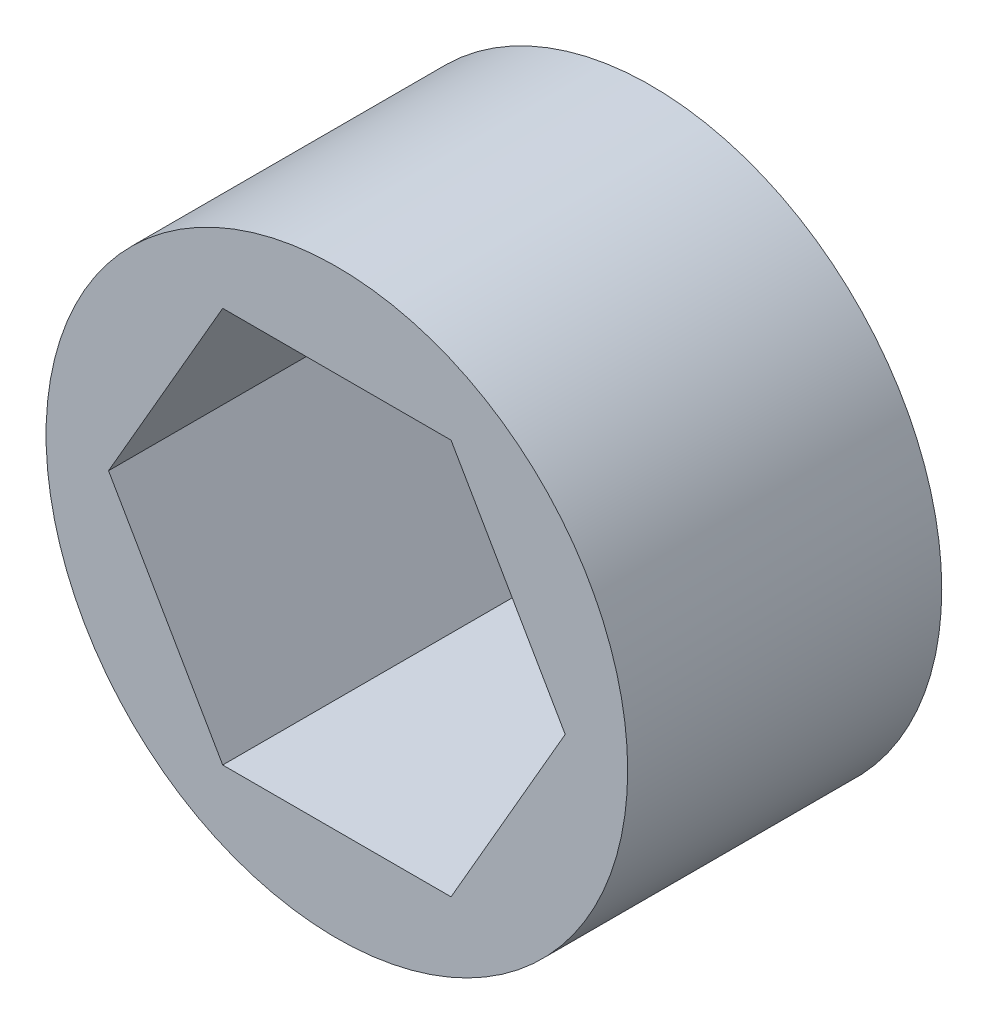
ISO-10303-21;
HEADER;
FILE_DESCRIPTION(('STEP AP214'),'2;1');
FILE_NAME('part.step','',(''),(''),'','','');
FILE_SCHEMA(('AUTOMOTIVE_DESIGN { 1 0 10303 214 1 1 1 1 }'));
ENDSEC;
DATA;
#1=APPLICATION_CONTEXT('core data for automotive mechanical design processes');
#2=APPLICATION_PROTOCOL_DEFINITION('international standard','automotive_design',2000,#1);
#3=PRODUCT_CONTEXT('',#1,'mechanical');
#4=PRODUCT('Part','Part','',(#3));
#5=PRODUCT_RELATED_PRODUCT_CATEGORY('part','',(#4));
#6=PRODUCT_DEFINITION_FORMATION('','',#4);
#7=PRODUCT_DEFINITION_CONTEXT('part definition',#1,'design');
#8=PRODUCT_DEFINITION('design','',#6,#7);
#9=PRODUCT_DEFINITION_SHAPE('','',#8);
#10=(LENGTH_UNIT() NAMED_UNIT(*) SI_UNIT(.MILLI.,.METRE.));
#11=(NAMED_UNIT(*) PLANE_ANGLE_UNIT() SI_UNIT($,.RADIAN.));
#12=(NAMED_UNIT(*) SI_UNIT($,.STERADIAN.) SOLID_ANGLE_UNIT());
#13=UNCERTAINTY_MEASURE_WITH_UNIT(LENGTH_MEASURE(1.E-05),#10,'distance_accuracy_value','');
#14=(GEOMETRIC_REPRESENTATION_CONTEXT(3) GLOBAL_UNCERTAINTY_ASSIGNED_CONTEXT((#13)) GLOBAL_UNIT_ASSIGNED_CONTEXT((#10,
#11,#12)) REPRESENTATION_CONTEXT('',''));
#15=CARTESIAN_POINT('',(0.,0.,0.));
#16=DIRECTION('',(0.,0.,1.));
#17=DIRECTION('',(1.,0.,0.));
#18=AXIS2_PLACEMENT_3D('',#15,#16,#17);
#19=CARTESIAN_POINT('',(0.,0.,5.1435));
#20=DIRECTION('',(0.,0.,1.));
#21=DIRECTION('',(1.,0.,0.));
#22=AXIS2_PLACEMENT_3D('',#19,#20,#21);
#23=PLANE('',#22);
#24=CARTESIAN_POINT('',(0.,0.,5.1435));
#25=DIRECTION('',(0.,0.,1.));
#26=DIRECTION('',(1.,0.,0.));
#27=AXIS2_PLACEMENT_3D('',#24,#25,#26);
#28=CIRCLE('',#27,9.525);
#29=CARTESIAN_POINT('',(9.525,0.,5.1435));
#30=VERTEX_POINT('',#29);
#31=EDGE_CURVE('E11',#30,#30,#28,.T.);
#32=ORIENTED_EDGE('',*,*,#31,.T.);
#33=EDGE_LOOP('',(#32));
#34=FACE_BOUND('',#33,.T.);
#35=DIRECTION('',(-0.5,0.866025403784438,0.));
#36=VECTOR('',#35,1.);
#37=CARTESIAN_POINT('',(7.47899538708241,0.,5.1435));
#38=LINE('',#37,#36);
#39=CARTESIAN_POINT('',(7.47899538708241,0.,5.1435));
#40=VERTEX_POINT('',#39);
#41=CARTESIAN_POINT('',(3.7394976935412,6.477,5.1435));
#42=VERTEX_POINT('',#41);
#43=EDGE_CURVE('E108',#40,#42,#38,.T.);
#44=ORIENTED_EDGE('',*,*,#43,.F.);
#45=DIRECTION('',(0.5,0.866025403784439,0.));
#46=VECTOR('',#45,1.);
#47=CARTESIAN_POINT('',(3.73949769354121,-6.477,5.1435));
#48=LINE('',#47,#46);
#49=CARTESIAN_POINT('',(3.73949769354121,-6.477,5.1435));
#50=VERTEX_POINT('',#49);
#51=EDGE_CURVE('E99',#50,#40,#48,.T.);
#52=ORIENTED_EDGE('',*,*,#51,.F.);
#53=DIRECTION('',(1.,0.,0.));
#54=VECTOR('',#53,1.);
#55=CARTESIAN_POINT('',(-3.73949769354121,-6.477,5.1435));
#56=LINE('',#55,#54);
#57=CARTESIAN_POINT('',(-3.73949769354121,-6.477,5.1435));
#58=VERTEX_POINT('',#57);
#59=EDGE_CURVE('E133',#58,#50,#56,.T.);
#60=ORIENTED_EDGE('',*,*,#59,.F.);
#61=DIRECTION('',(0.5,-0.866025403784438,0.));
#62=VECTOR('',#61,1.);
#63=CARTESIAN_POINT('',(-7.47899538708241,0.,5.1435));
#64=LINE('',#63,#62);
#65=CARTESIAN_POINT('',(-7.47899538708241,0.,5.1435));
#66=VERTEX_POINT('',#65);
#67=EDGE_CURVE('E130',#66,#58,#64,.T.);
#68=ORIENTED_EDGE('',*,*,#67,.F.);
#69=DIRECTION('',(-0.5,-0.866025403784439,0.));
#70=VECTOR('',#69,1.);
#71=CARTESIAN_POINT('',(-3.73949769354121,6.477,5.1435));
#72=LINE('',#71,#70);
#73=CARTESIAN_POINT('',(-3.73949769354121,6.477,5.1435));
#74=VERTEX_POINT('',#73);
#75=EDGE_CURVE('E125',#74,#66,#72,.T.);
#76=ORIENTED_EDGE('',*,*,#75,.F.);
#77=DIRECTION('',(-1.,0.,0.));
#78=VECTOR('',#77,1.);
#79=CARTESIAN_POINT('',(3.7394976935412,6.477,5.1435));
#80=LINE('',#79,#78);
#81=EDGE_CURVE('E121',#42,#74,#80,.T.);
#82=ORIENTED_EDGE('',*,*,#81,.F.);
#83=EDGE_LOOP('',(#44,#52,#60,#68,#76,#82));
#84=FACE_BOUND('',#83,.T.);
#85=ADVANCED_FACE('F45',(#34,#84),#23,.T.);
#86=CARTESIAN_POINT('',(0.,0.,-5.1435));
#87=DIRECTION('',(0.,0.,1.));
#88=DIRECTION('',(1.,0.,0.));
#89=AXIS2_PLACEMENT_3D('',#86,#87,#88);
#90=PLANE('',#89);
#91=CARTESIAN_POINT('',(0.,0.,-5.1435));
#92=DIRECTION('',(0.,0.,1.));
#93=DIRECTION('',(1.,0.,0.));
#94=AXIS2_PLACEMENT_3D('',#91,#92,#93);
#95=CIRCLE('',#94,9.525);
#96=CARTESIAN_POINT('',(9.525,0.,-5.1435));
#97=VERTEX_POINT('',#96);
#98=EDGE_CURVE('E49',#97,#97,#95,.T.);
#99=ORIENTED_EDGE('',*,*,#98,.F.);
#100=EDGE_LOOP('',(#99));
#101=FACE_BOUND('',#100,.T.);
#102=DIRECTION('',(0.5,0.866025403784439,0.));
#103=VECTOR('',#102,1.);
#104=CARTESIAN_POINT('',(3.73949769354121,-6.477,-5.1435));
#105=LINE('',#104,#103);
#106=CARTESIAN_POINT('',(3.73949769354121,-6.477,-5.1435));
#107=VERTEX_POINT('',#106);
#108=CARTESIAN_POINT('',(7.47899538708241,0.,-5.1435));
#109=VERTEX_POINT('',#108);
#110=EDGE_CURVE('E69',#107,#109,#105,.T.);
#111=ORIENTED_EDGE('',*,*,#110,.T.);
#112=DIRECTION('',(-0.5,0.866025403784438,0.));
#113=VECTOR('',#112,1.);
#114=CARTESIAN_POINT('',(7.47899538708241,0.,-5.1435));
#115=LINE('',#114,#113);
#116=CARTESIAN_POINT('',(3.7394976935412,6.477,-5.1435));
#117=VERTEX_POINT('',#116);
#118=EDGE_CURVE('E115',#109,#117,#115,.T.);
#119=ORIENTED_EDGE('',*,*,#118,.T.);
#120=DIRECTION('',(-1.,0.,0.));
#121=VECTOR('',#120,1.);
#122=CARTESIAN_POINT('',(3.7394976935412,6.477,-5.1435));
#123=LINE('',#122,#121);
#124=CARTESIAN_POINT('',(-3.73949769354121,6.477,-5.1435));
#125=VERTEX_POINT('',#124);
#126=EDGE_CURVE('E140',#117,#125,#123,.T.);
#127=ORIENTED_EDGE('',*,*,#126,.T.);
#128=DIRECTION('',(-0.5,-0.866025403784439,0.));
#129=VECTOR('',#128,1.);
#130=CARTESIAN_POINT('',(-3.73949769354121,6.477,-5.1435));
#131=LINE('',#130,#129);
#132=CARTESIAN_POINT('',(-7.47899538708241,0.,-5.1435));
#133=VERTEX_POINT('',#132);
#134=EDGE_CURVE('E144',#125,#133,#131,.T.);
#135=ORIENTED_EDGE('',*,*,#134,.T.);
#136=DIRECTION('',(0.5,-0.866025403784438,0.));
#137=VECTOR('',#136,1.);
#138=CARTESIAN_POINT('',(-7.47899538708241,0.,-5.1435));
#139=LINE('',#138,#137);
#140=CARTESIAN_POINT('',(-3.73949769354121,-6.477,-5.1435));
#141=VERTEX_POINT('',#140);
#142=EDGE_CURVE('E148',#133,#141,#139,.T.);
#143=ORIENTED_EDGE('',*,*,#142,.T.);
#144=DIRECTION('',(1.,0.,0.));
#145=VECTOR('',#144,1.);
#146=CARTESIAN_POINT('',(-3.73949769354121,-6.477,-5.1435));
#147=LINE('',#146,#145);
#148=EDGE_CURVE('E109',#141,#107,#147,.T.);
#149=ORIENTED_EDGE('',*,*,#148,.T.);
#150=EDGE_LOOP('',(#111,#119,#127,#135,#143,#149));
#151=FACE_BOUND('',#150,.T.);
#152=ADVANCED_FACE('F172',(#101,#151),#90,.F.);
#153=CARTESIAN_POINT('',(0.,0.,5.1435));
#154=DIRECTION('',(0.,0.,-1.));
#155=DIRECTION('',(-1.,0.,0.));
#156=AXIS2_PLACEMENT_3D('',#153,#154,#155);
#157=CYLINDRICAL_SURFACE('',#156,9.525);
#158=ORIENTED_EDGE('',*,*,#31,.F.);
#159=EDGE_LOOP('',(#158));
#160=FACE_BOUND('',#159,.T.);
#161=ORIENTED_EDGE('',*,*,#98,.T.);
#162=EDGE_LOOP('',(#161));
#163=FACE_BOUND('',#162,.T.);
#164=ADVANCED_FACE('F47',(#160,#163),#157,.T.);
#165=CARTESIAN_POINT('',(3.73949769354121,-6.477,5.1435));
#166=DIRECTION('',(-0.866025403784439,0.5,0.));
#167=DIRECTION('',(-0.5,-0.866025403784439,0.));
#168=AXIS2_PLACEMENT_3D('',#165,#166,#167);
#169=PLANE('',#168);
#170=ORIENTED_EDGE('',*,*,#110,.F.);
#171=DIRECTION('',(0.,0.,-1.));
#172=VECTOR('',#171,1.);
#173=CARTESIAN_POINT('',(3.73949769354121,-6.477,5.1435));
#174=LINE('',#173,#172);
#175=EDGE_CURVE('E103',#50,#107,#174,.T.);
#176=ORIENTED_EDGE('',*,*,#175,.F.);
#177=ORIENTED_EDGE('',*,*,#51,.T.);
#178=DIRECTION('',(0.,0.,-1.));
#179=VECTOR('',#178,1.);
#180=CARTESIAN_POINT('',(7.47899538708241,0.,5.1435));
#181=LINE('',#180,#179);
#182=EDGE_CURVE('E102',#40,#109,#181,.T.);
#183=ORIENTED_EDGE('',*,*,#182,.T.);
#184=EDGE_LOOP('',(#170,#176,#177,#183));
#185=FACE_BOUND('',#184,.T.);
#186=ADVANCED_FACE('F101',(#185),#169,.T.);
#187=CARTESIAN_POINT('',(7.47899538708241,0.,5.1435));
#188=DIRECTION('',(-0.866025403784438,-0.5,0.));
#189=DIRECTION('',(0.5,-0.866025403784438,0.));
#190=AXIS2_PLACEMENT_3D('',#187,#188,#189);
#191=PLANE('',#190);
#192=ORIENTED_EDGE('',*,*,#118,.F.);
#193=ORIENTED_EDGE('',*,*,#182,.F.);
#194=ORIENTED_EDGE('',*,*,#43,.T.);
#195=DIRECTION('',(0.,0.,-1.));
#196=VECTOR('',#195,1.);
#197=CARTESIAN_POINT('',(3.7394976935412,6.477,5.1435));
#198=LINE('',#197,#196);
#199=EDGE_CURVE('E117',#42,#117,#198,.T.);
#200=ORIENTED_EDGE('',*,*,#199,.T.);
#201=EDGE_LOOP('',(#192,#193,#194,#200));
#202=FACE_BOUND('',#201,.T.);
#203=ADVANCED_FACE('F112',(#202),#191,.T.);
#204=CARTESIAN_POINT('',(3.7394976935412,6.477,5.1435));
#205=DIRECTION('',(0.,-1.,0.));
#206=DIRECTION('',(0.,0.,-1.));
#207=AXIS2_PLACEMENT_3D('',#204,#205,#206);
#208=PLANE('',#207);
#209=ORIENTED_EDGE('',*,*,#126,.F.);
#210=ORIENTED_EDGE('',*,*,#199,.F.);
#211=ORIENTED_EDGE('',*,*,#81,.T.);
#212=DIRECTION('',(0.,0.,-1.));
#213=VECTOR('',#212,1.);
#214=CARTESIAN_POINT('',(-3.73949769354121,6.477,5.1435));
#215=LINE('',#214,#213);
#216=EDGE_CURVE('E162',#74,#125,#215,.T.);
#217=ORIENTED_EDGE('',*,*,#216,.T.);
#218=EDGE_LOOP('',(#209,#210,#211,#217));
#219=FACE_BOUND('',#218,.T.);
#220=ADVANCED_FACE('F168',(#219),#208,.T.);
#221=CARTESIAN_POINT('',(-3.73949769354121,6.477,5.1435));
#222=DIRECTION('',(0.866025403784439,-0.5,0.));
#223=DIRECTION('',(0.5,0.866025403784439,0.));
#224=AXIS2_PLACEMENT_3D('',#221,#222,#223);
#225=PLANE('',#224);
#226=ORIENTED_EDGE('',*,*,#134,.F.);
#227=ORIENTED_EDGE('',*,*,#216,.F.);
#228=ORIENTED_EDGE('',*,*,#75,.T.);
#229=DIRECTION('',(0.,0.,-1.));
#230=VECTOR('',#229,1.);
#231=CARTESIAN_POINT('',(-7.47899538708241,0.,5.1435));
#232=LINE('',#231,#230);
#233=EDGE_CURVE('E159',#66,#133,#232,.T.);
#234=ORIENTED_EDGE('',*,*,#233,.T.);
#235=EDGE_LOOP('',(#226,#227,#228,#234));
#236=FACE_BOUND('',#235,.T.);
#237=ADVANCED_FACE('F180',(#236),#225,.T.);
#238=CARTESIAN_POINT('',(-7.47899538708241,0.,5.1435));
#239=DIRECTION('',(0.866025403784439,0.5,0.));
#240=DIRECTION('',(-0.5,0.866025403784439,0.));
#241=AXIS2_PLACEMENT_3D('',#238,#239,#240);
#242=PLANE('',#241);
#243=ORIENTED_EDGE('',*,*,#142,.F.);
#244=ORIENTED_EDGE('',*,*,#233,.F.);
#245=ORIENTED_EDGE('',*,*,#67,.T.);
#246=DIRECTION('',(0.,0.,-1.));
#247=VECTOR('',#246,1.);
#248=CARTESIAN_POINT('',(-3.73949769354121,-6.477,5.1435));
#249=LINE('',#248,#247);
#250=EDGE_CURVE('E61',#58,#141,#249,.T.);
#251=ORIENTED_EDGE('',*,*,#250,.T.);
#252=EDGE_LOOP('',(#243,#244,#245,#251));
#253=FACE_BOUND('',#252,.T.);
#254=ADVANCED_FACE('F178',(#253),#242,.T.);
#255=CARTESIAN_POINT('',(-3.73949769354121,-6.477,5.1435));
#256=DIRECTION('',(0.,1.,0.));
#257=DIRECTION('',(-1.,0.,0.));
#258=AXIS2_PLACEMENT_3D('',#255,#256,#257);
#259=PLANE('',#258);
#260=ORIENTED_EDGE('',*,*,#148,.F.);
#261=ORIENTED_EDGE('',*,*,#250,.F.);
#262=ORIENTED_EDGE('',*,*,#59,.T.);
#263=ORIENTED_EDGE('',*,*,#175,.T.);
#264=EDGE_LOOP('',(#260,#261,#262,#263));
#265=FACE_BOUND('',#264,.T.);
#266=ADVANCED_FACE('F174',(#265),#259,.T.);
#267=CLOSED_SHELL('',(#85,#152,#164,#186,#203,#220,#237,#254,#266));
#268=MANIFOLD_SOLID_BREP('B2',#267);
#269=ADVANCED_BREP_SHAPE_REPRESENTATION('',(#18,#268),#14);
#270=SHAPE_DEFINITION_REPRESENTATION(#9,#269);
ENDSEC;
END-ISO-10303-21;
